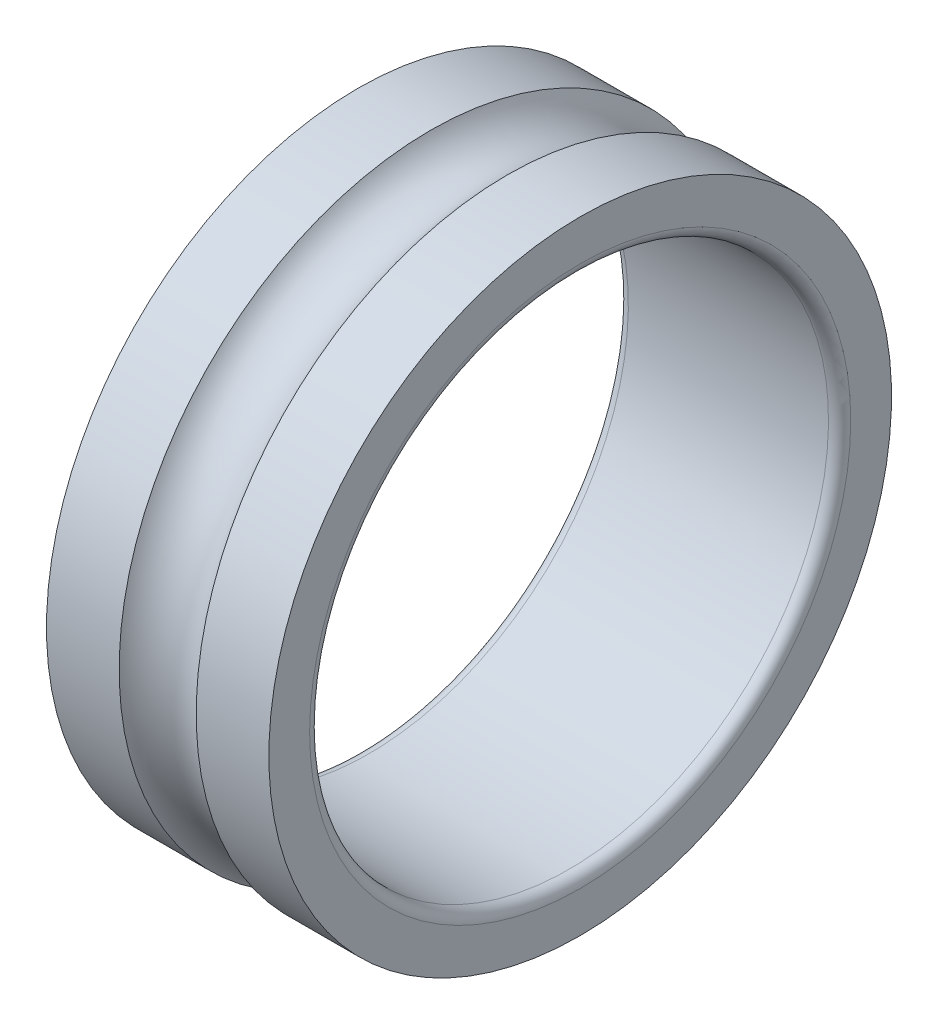
ISO-10303-21;
HEADER;
FILE_DESCRIPTION(('STEP AP214'),'2;1');
FILE_NAME('part.step','',(''),(''),'','','');
FILE_SCHEMA(('AUTOMOTIVE_DESIGN { 1 0 10303 214 1 1 1 1 }'));
ENDSEC;
DATA;
#1=APPLICATION_CONTEXT('core data for automotive mechanical design processes');
#2=APPLICATION_PROTOCOL_DEFINITION('international standard','automotive_design',2000,#1);
#3=PRODUCT_CONTEXT('',#1,'mechanical');
#4=PRODUCT('Part','Part','',(#3));
#5=PRODUCT_RELATED_PRODUCT_CATEGORY('part','',(#4));
#6=PRODUCT_DEFINITION_FORMATION('','',#4);
#7=PRODUCT_DEFINITION_CONTEXT('part definition',#1,'design');
#8=PRODUCT_DEFINITION('design','',#6,#7);
#9=PRODUCT_DEFINITION_SHAPE('','',#8);
#10=(LENGTH_UNIT() NAMED_UNIT(*) SI_UNIT(.MILLI.,.METRE.));
#11=(NAMED_UNIT(*) PLANE_ANGLE_UNIT() SI_UNIT($,.RADIAN.));
#12=(NAMED_UNIT(*) SI_UNIT($,.STERADIAN.) SOLID_ANGLE_UNIT());
#13=UNCERTAINTY_MEASURE_WITH_UNIT(LENGTH_MEASURE(1.E-05),#10,'distance_accuracy_value','');
#14=(GEOMETRIC_REPRESENTATION_CONTEXT(3) GLOBAL_UNCERTAINTY_ASSIGNED_CONTEXT((#13)) GLOBAL_UNIT_ASSIGNED_CONTEXT((#10,
#11,#12)) REPRESENTATION_CONTEXT('',''));
#15=CARTESIAN_POINT('',(0.,0.,0.));
#16=DIRECTION('',(0.,0.,1.));
#17=DIRECTION('',(1.,0.,0.));
#18=AXIS2_PLACEMENT_3D('',#15,#16,#17);
#19=CARTESIAN_POINT('',(2.50980762113533,0.,0.));
#20=DIRECTION('',(-1.,0.,0.));
#21=DIRECTION('',(0.,1.,0.));
#22=AXIS2_PLACEMENT_3D('',#19,#20,#21);
#23=CYLINDRICAL_SURFACE('',#22,4.2);
#24=CARTESIAN_POINT('',(2.01961524227067,0.,0.));
#25=DIRECTION('',(1.,0.,0.));
#26=DIRECTION('',(0.,1.,0.));
#27=AXIS2_PLACEMENT_3D('',#24,#25,#26);
#28=CIRCLE('',#27,4.2);
#29=CARTESIAN_POINT('',(2.01961524227067,4.2,0.));
#30=VERTEX_POINT('',#29);
#31=EDGE_CURVE('E10',#30,#30,#28,.T.);
#32=ORIENTED_EDGE('',*,*,#31,.T.);
#33=EDGE_LOOP('',(#32));
#34=FACE_BOUND('',#33,.T.);
#35=CARTESIAN_POINT('',(3.,0.,0.));
#36=DIRECTION('',(1.,0.,0.));
#37=DIRECTION('',(0.,1.,0.));
#38=AXIS2_PLACEMENT_3D('',#35,#36,#37);
#39=CIRCLE('',#38,4.2);
#40=CARTESIAN_POINT('',(3.,4.2,0.));
#41=VERTEX_POINT('',#40);
#42=EDGE_CURVE('E52',#41,#41,#39,.T.);
#43=ORIENTED_EDGE('',*,*,#42,.F.);
#44=EDGE_LOOP('',(#43));
#45=FACE_BOUND('',#44,.T.);
#46=ADVANCED_FACE('F16',(#34,#45),#23,.T.);
#47=CARTESIAN_POINT('',(1.5,0.,0.));
#48=DIRECTION('',(1.,0.,0.));
#49=DIRECTION('',(0.,0.,-1.));
#50=AXIS2_PLACEMENT_3D('',#47,#48,#49);
#51=TOROIDAL_SURFACE('',#50,4.5,0.6);
#52=CARTESIAN_POINT('',(0.980384757729336,0.,0.));
#53=DIRECTION('',(1.,0.,0.));
#54=DIRECTION('',(0.,1.,0.));
#55=AXIS2_PLACEMENT_3D('',#52,#53,#54);
#56=CIRCLE('',#55,4.2);
#57=CARTESIAN_POINT('',(0.980384757729336,4.2,0.));
#58=VERTEX_POINT('',#57);
#59=EDGE_CURVE('E20',#58,#58,#56,.T.);
#60=ORIENTED_EDGE('',*,*,#59,.T.);
#61=EDGE_LOOP('',(#60));
#62=FACE_BOUND('',#61,.T.);
#63=ORIENTED_EDGE('',*,*,#31,.F.);
#64=EDGE_LOOP('',(#63));
#65=FACE_BOUND('',#64,.T.);
#66=ADVANCED_FACE('F84',(#62,#65),#51,.F.);
#67=CARTESIAN_POINT('',(0.490192378864668,0.,0.));
#68=DIRECTION('',(-1.,0.,0.));
#69=DIRECTION('',(0.,1.,0.));
#70=AXIS2_PLACEMENT_3D('',#67,#68,#69);
#71=CYLINDRICAL_SURFACE('',#70,4.2);
#72=CARTESIAN_POINT('',(0.,0.,0.));
#73=DIRECTION('',(1.,0.,0.));
#74=DIRECTION('',(0.,1.,0.));
#75=AXIS2_PLACEMENT_3D('',#72,#73,#74);
#76=CIRCLE('',#75,4.2);
#77=CARTESIAN_POINT('',(0.,4.2,0.));
#78=VERTEX_POINT('',#77);
#79=EDGE_CURVE('E62',#78,#78,#76,.T.);
#80=ORIENTED_EDGE('',*,*,#79,.T.);
#81=EDGE_LOOP('',(#80));
#82=FACE_BOUND('',#81,.T.);
#83=ORIENTED_EDGE('',*,*,#59,.F.);
#84=EDGE_LOOP('',(#83));
#85=FACE_BOUND('',#84,.T.);
#86=ADVANCED_FACE('F89',(#82,#85),#71,.T.);
#87=CARTESIAN_POINT('',(0.,3.925,0.));
#88=DIRECTION('',(-1.,0.,0.));
#89=DIRECTION('',(0.,-1.,0.));
#90=AXIS2_PLACEMENT_3D('',#87,#88,#89);
#91=PLANE('',#90);
#92=CARTESIAN_POINT('',(0.,0.,0.));
#93=DIRECTION('',(1.,0.,0.));
#94=DIRECTION('',(0.,1.,0.));
#95=AXIS2_PLACEMENT_3D('',#92,#93,#94);
#96=CIRCLE('',#95,3.65);
#97=CARTESIAN_POINT('',(0.,3.65,0.));
#98=VERTEX_POINT('',#97);
#99=EDGE_CURVE('E63',#98,#98,#96,.T.);
#100=ORIENTED_EDGE('',*,*,#99,.T.);
#101=EDGE_LOOP('',(#100));
#102=FACE_BOUND('',#101,.T.);
#103=ORIENTED_EDGE('',*,*,#79,.F.);
#104=EDGE_LOOP('',(#103));
#105=FACE_BOUND('',#104,.T.);
#106=ADVANCED_FACE('F81',(#102,#105),#91,.T.);
#107=CARTESIAN_POINT('',(0.15,0.,0.));
#108=DIRECTION('',(1.,0.,0.));
#109=DIRECTION('',(0.,0.,-1.));
#110=AXIS2_PLACEMENT_3D('',#107,#108,#109);
#111=TOROIDAL_SURFACE('',#110,3.65,0.15);
#112=CARTESIAN_POINT('',(0.15,0.,0.));
#113=DIRECTION('',(1.,0.,0.));
#114=DIRECTION('',(0.,1.,0.));
#115=AXIS2_PLACEMENT_3D('',#112,#113,#114);
#116=CIRCLE('',#115,3.5);
#117=CARTESIAN_POINT('',(0.15,3.5,0.));
#118=VERTEX_POINT('',#117);
#119=EDGE_CURVE('E58',#118,#118,#116,.T.);
#120=ORIENTED_EDGE('',*,*,#119,.T.);
#121=EDGE_LOOP('',(#120));
#122=FACE_BOUND('',#121,.T.);
#123=ORIENTED_EDGE('',*,*,#99,.F.);
#124=EDGE_LOOP('',(#123));
#125=FACE_BOUND('',#124,.T.);
#126=ADVANCED_FACE('F18',(#122,#125),#111,.T.);
#127=CARTESIAN_POINT('',(1.5,0.,0.));
#128=DIRECTION('',(-1.,0.,0.));
#129=DIRECTION('',(0.,1.,0.));
#130=AXIS2_PLACEMENT_3D('',#127,#128,#129);
#131=CYLINDRICAL_SURFACE('',#130,3.5);
#132=CARTESIAN_POINT('',(2.85,0.,0.));
#133=DIRECTION('',(1.,0.,0.));
#134=DIRECTION('',(0.,1.,0.));
#135=AXIS2_PLACEMENT_3D('',#132,#133,#134);
#136=CIRCLE('',#135,3.5);
#137=CARTESIAN_POINT('',(2.85,3.5,0.));
#138=VERTEX_POINT('',#137);
#139=EDGE_CURVE('E56',#138,#138,#136,.T.);
#140=ORIENTED_EDGE('',*,*,#139,.T.);
#141=EDGE_LOOP('',(#140));
#142=FACE_BOUND('',#141,.T.);
#143=ORIENTED_EDGE('',*,*,#119,.F.);
#144=EDGE_LOOP('',(#143));
#145=FACE_BOUND('',#144,.T.);
#146=ADVANCED_FACE('F70',(#142,#145),#131,.F.);
#147=CARTESIAN_POINT('',(2.85,0.,0.));
#148=DIRECTION('',(1.,0.,0.));
#149=DIRECTION('',(0.,0.,-1.));
#150=AXIS2_PLACEMENT_3D('',#147,#148,#149);
#151=TOROIDAL_SURFACE('',#150,3.65,0.15);
#152=CARTESIAN_POINT('',(3.,0.,0.));
#153=DIRECTION('',(1.,0.,0.));
#154=DIRECTION('',(0.,1.,0.));
#155=AXIS2_PLACEMENT_3D('',#152,#153,#154);
#156=CIRCLE('',#155,3.65);
#157=CARTESIAN_POINT('',(3.,3.65,0.));
#158=VERTEX_POINT('',#157);
#159=EDGE_CURVE('E57',#158,#158,#156,.T.);
#160=ORIENTED_EDGE('',*,*,#159,.T.);
#161=EDGE_LOOP('',(#160));
#162=FACE_BOUND('',#161,.T.);
#163=ORIENTED_EDGE('',*,*,#139,.F.);
#164=EDGE_LOOP('',(#163));
#165=FACE_BOUND('',#164,.T.);
#166=ADVANCED_FACE('F72',(#162,#165),#151,.T.);
#167=CARTESIAN_POINT('',(3.,3.925,0.));
#168=DIRECTION('',(1.,0.,0.));
#169=DIRECTION('',(0.,1.,0.));
#170=AXIS2_PLACEMENT_3D('',#167,#168,#169);
#171=PLANE('',#170);
#172=ORIENTED_EDGE('',*,*,#42,.T.);
#173=EDGE_LOOP('',(#172));
#174=FACE_BOUND('',#173,.T.);
#175=ORIENTED_EDGE('',*,*,#159,.F.);
#176=EDGE_LOOP('',(#175));
#177=FACE_BOUND('',#176,.T.);
#178=ADVANCED_FACE('F53',(#174,#177),#171,.T.);
#179=CLOSED_SHELL('',(#46,#66,#86,#106,#126,#146,#166,#178));
#180=MANIFOLD_SOLID_BREP('B1',#179);
#181=ADVANCED_BREP_SHAPE_REPRESENTATION('',(#18,#180),#14);
#182=SHAPE_DEFINITION_REPRESENTATION(#9,#181);
ENDSEC;
END-ISO-10303-21;
